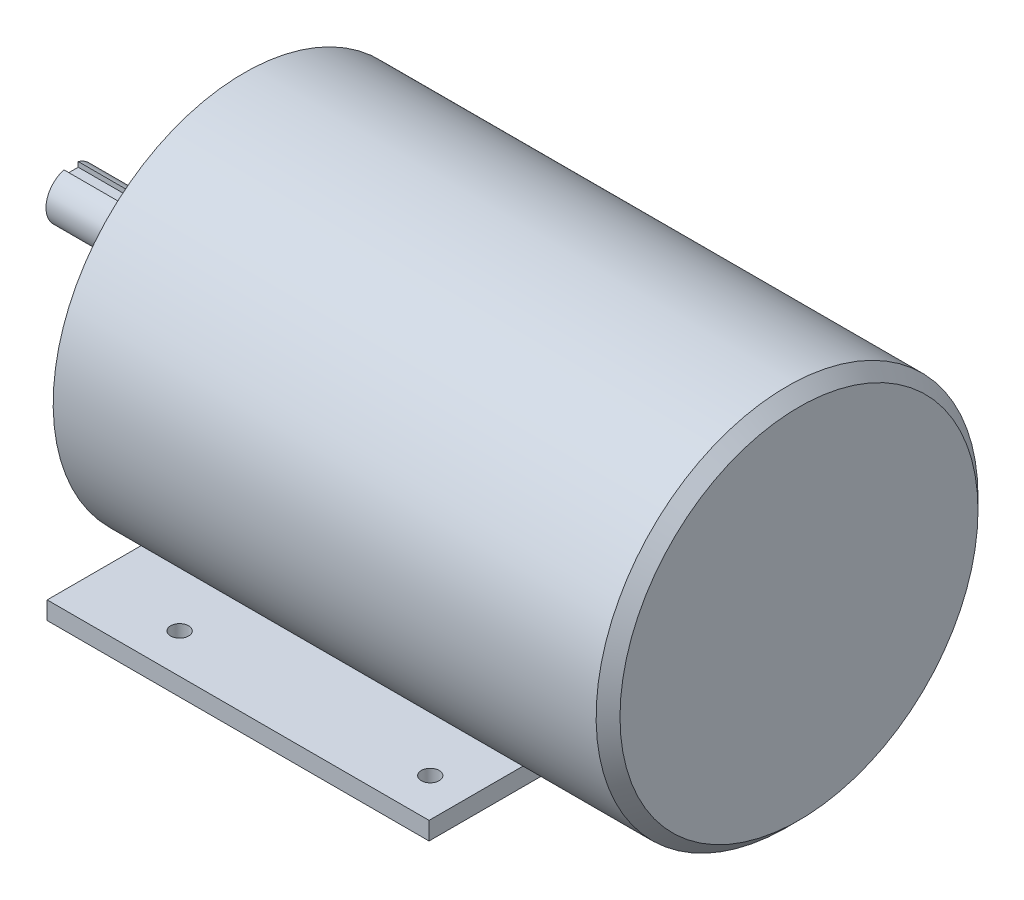
ISO-10303-21;
HEADER;
FILE_DESCRIPTION(('STEP AP214'),'2;1');
FILE_NAME('part.step','',(''),(''),'','','');
FILE_SCHEMA(('AUTOMOTIVE_DESIGN { 1 0 10303 214 1 1 1 1 }'));
ENDSEC;
DATA;
#1=APPLICATION_CONTEXT('core data for automotive mechanical design processes');
#2=APPLICATION_PROTOCOL_DEFINITION('international standard','automotive_design',2000,#1);
#3=PRODUCT_CONTEXT('',#1,'mechanical');
#4=PRODUCT('Part','Part','',(#3));
#5=PRODUCT_RELATED_PRODUCT_CATEGORY('part','',(#4));
#6=PRODUCT_DEFINITION_FORMATION('','',#4);
#7=PRODUCT_DEFINITION_CONTEXT('part definition',#1,'design');
#8=PRODUCT_DEFINITION('design','',#6,#7);
#9=PRODUCT_DEFINITION_SHAPE('','',#8);
#10=(LENGTH_UNIT() NAMED_UNIT(*) SI_UNIT(.MILLI.,.METRE.));
#11=(NAMED_UNIT(*) PLANE_ANGLE_UNIT() SI_UNIT($,.RADIAN.));
#12=(NAMED_UNIT(*) SI_UNIT($,.STERADIAN.) SOLID_ANGLE_UNIT());
#13=UNCERTAINTY_MEASURE_WITH_UNIT(LENGTH_MEASURE(1.E-05),#10,'distance_accuracy_value','');
#14=(GEOMETRIC_REPRESENTATION_CONTEXT(3) GLOBAL_UNCERTAINTY_ASSIGNED_CONTEXT((#13)) GLOBAL_UNIT_ASSIGNED_CONTEXT((#10,
#11,#12)) REPRESENTATION_CONTEXT('',''));
#15=CARTESIAN_POINT('',(0.,0.,0.));
#16=DIRECTION('',(0.,0.,1.));
#17=DIRECTION('',(1.,0.,0.));
#18=AXIS2_PLACEMENT_3D('',#15,#16,#17);
#19=CARTESIAN_POINT('',(610.,0.,0.));
#20=DIRECTION('',(-1.,0.,0.));
#21=DIRECTION('',(0.,0.,1.));
#22=AXIS2_PLACEMENT_3D('',#19,#20,#21);
#23=CYLINDRICAL_SURFACE('',#22,160.);
#24=CARTESIAN_POINT('',(600.,0.,0.));
#25=DIRECTION('',(1.,0.,0.));
#26=DIRECTION('',(0.,0.,-1.));
#27=AXIS2_PLACEMENT_3D('',#24,#25,#26);
#28=CIRCLE('',#27,160.);
#29=CARTESIAN_POINT('',(600.,0.,-160.));
#30=VERTEX_POINT('',#29);
#31=EDGE_CURVE('E315',#30,#30,#28,.F.);
#32=ORIENTED_EDGE('',*,*,#31,.T.);
#33=EDGE_LOOP('',(#32));
#34=FACE_BOUND('',#33,.T.);
#35=DIRECTION('',(-1.,0.,0.));
#36=VECTOR('',#35,1.);
#37=CARTESIAN_POINT('',(610.,-145.,-67.6387462923435));
#38=LINE('',#37,#36);
#39=CARTESIAN_POINT('',(145.021608211735,-145.,-67.6387462923435));
#40=VERTEX_POINT('',#39);
#41=CARTESIAN_POINT('',(460.,-145.,-67.6387462923435));
#42=VERTEX_POINT('',#41);
#43=EDGE_CURVE('E309',#40,#42,#38,.F.);
#44=ORIENTED_EDGE('',*,*,#43,.F.);
#45=CARTESIAN_POINT('',(145.021608211735,0.,0.));
#46=DIRECTION('',(1.,0.,0.));
#47=DIRECTION('',(0.,0.,-1.));
#48=AXIS2_PLACEMENT_3D('',#45,#46,#47);
#49=CIRCLE('',#48,160.);
#50=CARTESIAN_POINT('',(145.021608211735,-145.,67.6387462923433));
#51=VERTEX_POINT('',#50);
#52=EDGE_CURVE('E353',#40,#51,#49,.T.);
#53=ORIENTED_EDGE('',*,*,#52,.T.);
#54=DIRECTION('',(-1.,0.,0.));
#55=VECTOR('',#54,1.);
#56=CARTESIAN_POINT('',(610.,-145.,67.6387462923433));
#57=LINE('',#56,#55);
#58=CARTESIAN_POINT('',(460.,-145.,67.6387462923433));
#59=VERTEX_POINT('',#58);
#60=EDGE_CURVE('E312',#59,#51,#57,.T.);
#61=ORIENTED_EDGE('',*,*,#60,.F.);
#62=CARTESIAN_POINT('',(460.,0.,0.));
#63=DIRECTION('',(-1.,0.,0.));
#64=DIRECTION('',(0.,0.,1.));
#65=AXIS2_PLACEMENT_3D('',#62,#63,#64);
#66=CIRCLE('',#65,160.);
#67=CARTESIAN_POINT('',(460.,-160.,0.));
#68=VERTEX_POINT('',#67);
#69=EDGE_CURVE('E301',#68,#59,#66,.T.);
#70=ORIENTED_EDGE('',*,*,#69,.F.);
#71=EDGE_CURVE('E310',#42,#68,#66,.T.);
#72=ORIENTED_EDGE('',*,*,#71,.F.);
#73=EDGE_LOOP('',(#44,#53,#61,#70,#72));
#74=FACE_BOUND('',#73,.T.);
#75=ADVANCED_FACE('F44',(#34,#74),#23,.T.);
#76=CARTESIAN_POINT('',(610.,0.,0.));
#77=DIRECTION('',(1.,0.,0.));
#78=DIRECTION('',(0.,0.,-1.));
#79=AXIS2_PLACEMENT_3D('',#76,#77,#78);
#80=PLANE('',#79);
#81=CARTESIAN_POINT('',(610.,0.,0.));
#82=DIRECTION('',(1.,0.,0.));
#83=DIRECTION('',(0.,0.,-1.));
#84=AXIS2_PLACEMENT_3D('',#81,#82,#83);
#85=CIRCLE('',#84,150.);
#86=CARTESIAN_POINT('',(610.,0.,-150.));
#87=VERTEX_POINT('',#86);
#88=EDGE_CURVE('E318',#87,#87,#85,.T.);
#89=ORIENTED_EDGE('',*,*,#88,.T.);
#90=EDGE_LOOP('',(#89));
#91=FACE_BOUND('',#90,.T.);
#92=ADVANCED_FACE('F272',(#91),#80,.T.);
#93=CARTESIAN_POINT('',(460.,-145.,160.));
#94=DIRECTION('',(-1.,0.,0.));
#95=DIRECTION('',(0.,0.,1.));
#96=AXIS2_PLACEMENT_3D('',#93,#94,#95);
#97=PLANE('',#96);
#98=DIRECTION('',(0.,0.,-1.));
#99=VECTOR('',#98,1.);
#100=CARTESIAN_POINT('',(460.,-145.,160.));
#101=LINE('',#100,#99);
#102=CARTESIAN_POINT('',(460.,-145.,-160.));
#103=VERTEX_POINT('',#102);
#104=EDGE_CURVE('E388',#42,#103,#101,.T.);
#105=ORIENTED_EDGE('',*,*,#104,.F.);
#106=ORIENTED_EDGE('',*,*,#71,.T.);
#107=DIRECTION('',(0.,0.,-1.));
#108=VECTOR('',#107,1.);
#109=CARTESIAN_POINT('',(460.,-160.,160.));
#110=LINE('',#109,#108);
#111=CARTESIAN_POINT('',(460.,-160.,-160.));
#112=VERTEX_POINT('',#111);
#113=EDGE_CURVE('E381',#68,#112,#110,.T.);
#114=ORIENTED_EDGE('',*,*,#113,.T.);
#115=DIRECTION('',(0.,-1.,0.));
#116=VECTOR('',#115,1.);
#117=CARTESIAN_POINT('',(460.,-145.,-160.));
#118=LINE('',#117,#116);
#119=EDGE_CURVE('E298',#103,#112,#118,.T.);
#120=ORIENTED_EDGE('',*,*,#119,.F.);
#121=EDGE_LOOP('',(#105,#106,#114,#120));
#122=FACE_BOUND('',#121,.T.);
#123=ADVANCED_FACE('F271',(#122),#97,.F.);
#124=CARTESIAN_POINT('',(140.,-145.,160.));
#125=DIRECTION('',(1.,0.,0.));
#126=DIRECTION('',(0.,0.,-1.));
#127=AXIS2_PLACEMENT_3D('',#124,#125,#126);
#128=PLANE('',#127);
#129=DIRECTION('',(0.,0.,1.));
#130=VECTOR('',#129,1.);
#131=CARTESIAN_POINT('',(140.,-145.,160.));
#132=LINE('',#131,#130);
#133=CARTESIAN_POINT('',(140.,-145.,79.8435447691281));
#134=VERTEX_POINT('',#133);
#135=CARTESIAN_POINT('',(140.,-145.,160.));
#136=VERTEX_POINT('',#135);
#137=EDGE_CURVE('E390',#134,#136,#132,.T.);
#138=ORIENTED_EDGE('',*,*,#137,.F.);
#139=CARTESIAN_POINT('',(140.,0.,0.));
#140=DIRECTION('',(1.,0.,0.));
#141=DIRECTION('',(0.,0.,-1.));
#142=AXIS2_PLACEMENT_3D('',#139,#140,#141);
#143=CIRCLE('',#142,165.529428324089);
#144=CARTESIAN_POINT('',(140.,-160.,42.4263083628517));
#145=VERTEX_POINT('',#144);
#146=EDGE_CURVE('E344',#134,#145,#143,.T.);
#147=ORIENTED_EDGE('',*,*,#146,.T.);
#148=DIRECTION('',(0.,0.,1.));
#149=VECTOR('',#148,1.);
#150=CARTESIAN_POINT('',(140.,-160.,160.));
#151=LINE('',#150,#149);
#152=CARTESIAN_POINT('',(140.,-160.,160.));
#153=VERTEX_POINT('',#152);
#154=EDGE_CURVE('E402',#145,#153,#151,.T.);
#155=ORIENTED_EDGE('',*,*,#154,.T.);
#156=DIRECTION('',(0.,-1.,0.));
#157=VECTOR('',#156,1.);
#158=CARTESIAN_POINT('',(140.,-145.,160.));
#159=LINE('',#158,#157);
#160=EDGE_CURVE('E410',#136,#153,#159,.T.);
#161=ORIENTED_EDGE('',*,*,#160,.F.);
#162=EDGE_LOOP('',(#138,#147,#155,#161));
#163=FACE_BOUND('',#162,.T.);
#164=ADVANCED_FACE('F250',(#163),#128,.F.);
#165=CARTESIAN_POINT('',(0.,-145.,0.));
#166=DIRECTION('',(0.,-1.,0.));
#167=DIRECTION('',(0.,0.,-1.));
#168=AXIS2_PLACEMENT_3D('',#165,#166,#167);
#169=PLANE('',#168);
#170=CARTESIAN_POINT('',(218.,-145.,127.));
#171=DIRECTION('',(0.,-1.,0.));
#172=DIRECTION('',(0.,0.,-1.));
#173=AXIS2_PLACEMENT_3D('',#170,#171,#172);
#174=CIRCLE('',#173,7.50000000000001);
#175=CARTESIAN_POINT('',(218.,-145.,119.5));
#176=VERTEX_POINT('',#175);
#177=EDGE_CURVE('E360',#176,#176,#174,.T.);
#178=ORIENTED_EDGE('',*,*,#177,.T.);
#179=EDGE_LOOP('',(#178));
#180=FACE_BOUND('',#179,.T.);
#181=CARTESIAN_POINT('',(428.,-145.,127.));
#182=DIRECTION('',(0.,-1.,0.));
#183=DIRECTION('',(0.,0.,-1.));
#184=AXIS2_PLACEMENT_3D('',#181,#182,#183);
#185=CIRCLE('',#184,7.50000000000001);
#186=CARTESIAN_POINT('',(428.,-145.,119.5));
#187=VERTEX_POINT('',#186);
#188=EDGE_CURVE('E378',#187,#187,#185,.T.);
#189=ORIENTED_EDGE('',*,*,#188,.T.);
#190=EDGE_LOOP('',(#189));
#191=FACE_BOUND('',#190,.T.);
#192=DIRECTION('',(0.,0.,1.));
#193=VECTOR('',#192,1.);
#194=CARTESIAN_POINT('',(145.021608211735,-145.,0.));
#195=LINE('',#194,#193);
#196=CARTESIAN_POINT('',(145.021608211735,-145.,79.8435447691281));
#197=VERTEX_POINT('',#196);
#198=EDGE_CURVE('E356',#51,#197,#195,.T.);
#199=ORIENTED_EDGE('',*,*,#198,.T.);
#200=DIRECTION('',(1.,0.,0.));
#201=VECTOR('',#200,1.);
#202=CARTESIAN_POINT('',(0.,-145.,79.8435447691281));
#203=LINE('',#202,#201);
#204=EDGE_CURVE('E347',#197,#134,#203,.F.);
#205=ORIENTED_EDGE('',*,*,#204,.T.);
#206=ORIENTED_EDGE('',*,*,#137,.T.);
#207=DIRECTION('',(1.,0.,0.));
#208=VECTOR('',#207,1.);
#209=CARTESIAN_POINT('',(140.,-145.,160.));
#210=LINE('',#209,#208);
#211=CARTESIAN_POINT('',(460.,-145.,160.));
#212=VERTEX_POINT('',#211);
#213=EDGE_CURVE('E394',#136,#212,#210,.T.);
#214=ORIENTED_EDGE('',*,*,#213,.T.);
#215=EDGE_CURVE('E384',#212,#59,#101,.T.);
#216=ORIENTED_EDGE('',*,*,#215,.T.);
#217=ORIENTED_EDGE('',*,*,#60,.T.);
#218=EDGE_LOOP('',(#199,#205,#206,#214,#216,#217));
#219=FACE_BOUND('',#218,.T.);
#220=ADVANCED_FACE('F246',(#180,#191,#219),#169,.F.);
#221=CARTESIAN_POINT('',(428.,-145.,-127.));
#222=DIRECTION('',(0.,-1.,0.));
#223=DIRECTION('',(0.,0.,-1.));
#224=AXIS2_PLACEMENT_3D('',#221,#222,#223);
#225=CIRCLE('',#224,7.50000000000001);
#226=CARTESIAN_POINT('',(428.,-145.,-134.5));
#227=VERTEX_POINT('',#226);
#228=EDGE_CURVE('E373',#227,#227,#225,.T.);
#229=ORIENTED_EDGE('',*,*,#228,.T.);
#230=EDGE_LOOP('',(#229));
#231=FACE_BOUND('',#230,.T.);
#232=CARTESIAN_POINT('',(218.,-145.,-127.));
#233=DIRECTION('',(0.,-1.,0.));
#234=DIRECTION('',(0.,0.,-1.));
#235=AXIS2_PLACEMENT_3D('',#232,#233,#234);
#236=CIRCLE('',#235,7.50000000000001);
#237=CARTESIAN_POINT('',(218.,-145.,-134.5));
#238=VERTEX_POINT('',#237);
#239=EDGE_CURVE('E367',#238,#238,#236,.T.);
#240=ORIENTED_EDGE('',*,*,#239,.T.);
#241=EDGE_LOOP('',(#240));
#242=FACE_BOUND('',#241,.T.);
#243=CARTESIAN_POINT('',(140.,-145.,-160.));
#244=VERTEX_POINT('',#243);
#245=CARTESIAN_POINT('',(140.,-145.,-79.8435447691282));
#246=VERTEX_POINT('',#245);
#247=EDGE_CURVE('E391',#244,#246,#132,.T.);
#248=ORIENTED_EDGE('',*,*,#247,.T.);
#249=DIRECTION('',(1.,0.,0.));
#250=VECTOR('',#249,1.);
#251=CARTESIAN_POINT('',(0.,-145.,-79.8435447691282));
#252=LINE('',#251,#250);
#253=CARTESIAN_POINT('',(145.021608211735,-145.,-79.8435447691282));
#254=VERTEX_POINT('',#253);
#255=EDGE_CURVE('E67',#246,#254,#252,.T.);
#256=ORIENTED_EDGE('',*,*,#255,.T.);
#257=DIRECTION('',(0.,0.,1.));
#258=VECTOR('',#257,1.);
#259=CARTESIAN_POINT('',(145.021608211735,-145.,0.));
#260=LINE('',#259,#258);
#261=EDGE_CURVE('E350',#254,#40,#260,.T.);
#262=ORIENTED_EDGE('',*,*,#261,.T.);
#263=ORIENTED_EDGE('',*,*,#43,.T.);
#264=ORIENTED_EDGE('',*,*,#104,.T.);
#265=DIRECTION('',(-1.,0.,0.));
#266=VECTOR('',#265,1.);
#267=CARTESIAN_POINT('',(140.,-145.,-160.));
#268=LINE('',#267,#266);
#269=EDGE_CURVE('E387',#103,#244,#268,.T.);
#270=ORIENTED_EDGE('',*,*,#269,.T.);
#271=EDGE_LOOP('',(#248,#256,#262,#263,#264,#270));
#272=FACE_BOUND('',#271,.T.);
#273=ADVANCED_FACE('F249',(#231,#242,#272),#169,.F.);
#274=CARTESIAN_POINT('',(0.,-160.,0.));
#275=DIRECTION('',(0.,-1.,0.));
#276=DIRECTION('',(0.,0.,-1.));
#277=AXIS2_PLACEMENT_3D('',#274,#275,#276);
#278=PLANE('',#277);
#279=DIRECTION('',(1.,0.,0.));
#280=VECTOR('',#279,1.);
#281=CARTESIAN_POINT('',(0.,-160.,-42.4263083628517));
#282=LINE('',#281,#280);
#283=CARTESIAN_POINT('',(140.,-160.,-42.4263083628517));
#284=VERTEX_POINT('',#283);
#285=CARTESIAN_POINT('',(145.021608211735,-160.,-42.4263083628517));
#286=VERTEX_POINT('',#285);
#287=EDGE_CURVE('E332',#284,#286,#282,.T.);
#288=ORIENTED_EDGE('',*,*,#287,.F.);
#289=CARTESIAN_POINT('',(140.,-160.,-160.));
#290=VERTEX_POINT('',#289);
#291=EDGE_CURVE('E403',#290,#284,#151,.T.);
#292=ORIENTED_EDGE('',*,*,#291,.F.);
#293=DIRECTION('',(-1.,0.,0.));
#294=VECTOR('',#293,1.);
#295=CARTESIAN_POINT('',(140.,-160.,-160.));
#296=LINE('',#295,#294);
#297=EDGE_CURVE('E400',#112,#290,#296,.T.);
#298=ORIENTED_EDGE('',*,*,#297,.F.);
#299=ORIENTED_EDGE('',*,*,#113,.F.);
#300=CARTESIAN_POINT('',(460.,-160.,160.));
#301=VERTEX_POINT('',#300);
#302=EDGE_CURVE('E397',#301,#68,#110,.T.);
#303=ORIENTED_EDGE('',*,*,#302,.F.);
#304=DIRECTION('',(1.,0.,0.));
#305=VECTOR('',#304,1.);
#306=CARTESIAN_POINT('',(140.,-160.,160.));
#307=LINE('',#306,#305);
#308=EDGE_CURVE('E406',#153,#301,#307,.T.);
#309=ORIENTED_EDGE('',*,*,#308,.F.);
#310=ORIENTED_EDGE('',*,*,#154,.F.);
#311=DIRECTION('',(1.,0.,0.));
#312=VECTOR('',#311,1.);
#313=CARTESIAN_POINT('',(0.,-160.,42.4263083628517));
#314=LINE('',#313,#312);
#315=CARTESIAN_POINT('',(145.021608211735,-160.,42.4263083628517));
#316=VERTEX_POINT('',#315);
#317=EDGE_CURVE('E342',#316,#145,#314,.F.);
#318=ORIENTED_EDGE('',*,*,#317,.F.);
#319=DIRECTION('',(0.,0.,1.));
#320=VECTOR('',#319,1.);
#321=CARTESIAN_POINT('',(145.021608211735,-160.,0.));
#322=LINE('',#321,#320);
#323=EDGE_CURVE('E323',#286,#316,#322,.T.);
#324=ORIENTED_EDGE('',*,*,#323,.F.);
#325=EDGE_LOOP('',(#288,#292,#298,#299,#303,#309,#310,#318,#324));
#326=FACE_BOUND('',#325,.T.);
#327=CARTESIAN_POINT('',(428.,-160.,-127.));
#328=DIRECTION('',(0.,-1.,0.));
#329=DIRECTION('',(0.,0.,-1.));
#330=AXIS2_PLACEMENT_3D('',#327,#328,#329);
#331=CIRCLE('',#330,7.50000000000001);
#332=CARTESIAN_POINT('',(428.,-160.,-134.5));
#333=VERTEX_POINT('',#332);
#334=EDGE_CURVE('E359',#333,#333,#331,.T.);
#335=ORIENTED_EDGE('',*,*,#334,.F.);
#336=EDGE_LOOP('',(#335));
#337=FACE_BOUND('',#336,.T.);
#338=CARTESIAN_POINT('',(218.,-160.,-127.));
#339=DIRECTION('',(0.,-1.,0.));
#340=DIRECTION('',(0.,0.,-1.));
#341=AXIS2_PLACEMENT_3D('',#338,#339,#340);
#342=CIRCLE('',#341,7.50000000000001);
#343=CARTESIAN_POINT('',(218.,-160.,-134.5));
#344=VERTEX_POINT('',#343);
#345=EDGE_CURVE('E370',#344,#344,#342,.T.);
#346=ORIENTED_EDGE('',*,*,#345,.F.);
#347=EDGE_LOOP('',(#346));
#348=FACE_BOUND('',#347,.T.);
#349=CARTESIAN_POINT('',(218.,-160.,127.));
#350=DIRECTION('',(0.,-1.,0.));
#351=DIRECTION('',(0.,0.,-1.));
#352=AXIS2_PLACEMENT_3D('',#349,#350,#351);
#353=CIRCLE('',#352,7.50000000000001);
#354=CARTESIAN_POINT('',(218.,-160.,119.5));
#355=VERTEX_POINT('',#354);
#356=EDGE_CURVE('E364',#355,#355,#353,.T.);
#357=ORIENTED_EDGE('',*,*,#356,.F.);
#358=EDGE_LOOP('',(#357));
#359=FACE_BOUND('',#358,.T.);
#360=CARTESIAN_POINT('',(428.,-160.,127.));
#361=DIRECTION('',(0.,-1.,0.));
#362=DIRECTION('',(0.,0.,-1.));
#363=AXIS2_PLACEMENT_3D('',#360,#361,#362);
#364=CIRCLE('',#363,7.50000000000001);
#365=CARTESIAN_POINT('',(428.,-160.,119.5));
#366=VERTEX_POINT('',#365);
#367=EDGE_CURVE('E363',#366,#366,#364,.T.);
#368=ORIENTED_EDGE('',*,*,#367,.F.);
#369=EDGE_LOOP('',(#368));
#370=FACE_BOUND('',#369,.T.);
#371=ADVANCED_FACE('F252',(#326,#337,#348,#359,#370),#278,.T.);
#372=ORIENTED_EDGE('',*,*,#302,.T.);
#373=ORIENTED_EDGE('',*,*,#69,.T.);
#374=ORIENTED_EDGE('',*,*,#215,.F.);
#375=DIRECTION('',(0.,-1.,0.));
#376=VECTOR('',#375,1.);
#377=CARTESIAN_POINT('',(460.,-145.,160.));
#378=LINE('',#377,#376);
#379=EDGE_CURVE('E396',#212,#301,#378,.T.);
#380=ORIENTED_EDGE('',*,*,#379,.T.);
#381=EDGE_LOOP('',(#372,#373,#374,#380));
#382=FACE_BOUND('',#381,.T.);
#383=ADVANCED_FACE('F255',(#382),#97,.F.);
#384=CARTESIAN_POINT('',(140.,-145.,-160.));
#385=DIRECTION('',(0.,0.,1.));
#386=DIRECTION('',(1.,0.,0.));
#387=AXIS2_PLACEMENT_3D('',#384,#385,#386);
#388=PLANE('',#387);
#389=ORIENTED_EDGE('',*,*,#297,.T.);
#390=DIRECTION('',(0.,-1.,0.));
#391=VECTOR('',#390,1.);
#392=CARTESIAN_POINT('',(140.,-145.,-160.));
#393=LINE('',#392,#391);
#394=EDGE_CURVE('E304',#244,#290,#393,.T.);
#395=ORIENTED_EDGE('',*,*,#394,.F.);
#396=ORIENTED_EDGE('',*,*,#269,.F.);
#397=ORIENTED_EDGE('',*,*,#119,.T.);
#398=EDGE_LOOP('',(#389,#395,#396,#397));
#399=FACE_BOUND('',#398,.T.);
#400=ADVANCED_FACE('F263',(#399),#388,.F.);
#401=ORIENTED_EDGE('',*,*,#291,.T.);
#402=CARTESIAN_POINT('',(140.,0.,0.));
#403=DIRECTION('',(1.,0.,0.));
#404=DIRECTION('',(0.,0.,-1.));
#405=AXIS2_PLACEMENT_3D('',#402,#403,#404);
#406=CIRCLE('',#405,165.529428324089);
#407=EDGE_CURVE('E321',#284,#246,#406,.T.);
#408=ORIENTED_EDGE('',*,*,#407,.T.);
#409=ORIENTED_EDGE('',*,*,#247,.F.);
#410=ORIENTED_EDGE('',*,*,#394,.T.);
#411=EDGE_LOOP('',(#401,#408,#409,#410));
#412=FACE_BOUND('',#411,.T.);
#413=ADVANCED_FACE('F259',(#412),#128,.F.);
#414=CARTESIAN_POINT('',(140.,-145.,160.));
#415=DIRECTION('',(0.,0.,-1.));
#416=DIRECTION('',(-1.,0.,0.));
#417=AXIS2_PLACEMENT_3D('',#414,#415,#416);
#418=PLANE('',#417);
#419=ORIENTED_EDGE('',*,*,#308,.T.);
#420=ORIENTED_EDGE('',*,*,#379,.F.);
#421=ORIENTED_EDGE('',*,*,#213,.F.);
#422=ORIENTED_EDGE('',*,*,#160,.T.);
#423=EDGE_LOOP('',(#419,#420,#421,#422));
#424=FACE_BOUND('',#423,.T.);
#425=ADVANCED_FACE('F244',(#424),#418,.F.);
#426=CARTESIAN_POINT('',(428.,-145.,127.));
#427=DIRECTION('',(0.,-1.,0.));
#428=DIRECTION('',(0.,0.,-1.));
#429=AXIS2_PLACEMENT_3D('',#426,#427,#428);
#430=CYLINDRICAL_SURFACE('',#429,7.50000000000001);
#431=ORIENTED_EDGE('',*,*,#188,.F.);
#432=EDGE_LOOP('',(#431));
#433=FACE_BOUND('',#432,.T.);
#434=ORIENTED_EDGE('',*,*,#367,.T.);
#435=EDGE_LOOP('',(#434));
#436=FACE_BOUND('',#435,.T.);
#437=ADVANCED_FACE('F233',(#433,#436),#430,.F.);
#438=CARTESIAN_POINT('',(218.,-145.,127.));
#439=DIRECTION('',(0.,-1.,0.));
#440=DIRECTION('',(0.,0.,-1.));
#441=AXIS2_PLACEMENT_3D('',#438,#439,#440);
#442=CYLINDRICAL_SURFACE('',#441,7.50000000000001);
#443=ORIENTED_EDGE('',*,*,#177,.F.);
#444=EDGE_LOOP('',(#443));
#445=FACE_BOUND('',#444,.T.);
#446=ORIENTED_EDGE('',*,*,#356,.T.);
#447=EDGE_LOOP('',(#446));
#448=FACE_BOUND('',#447,.T.);
#449=ADVANCED_FACE('F229',(#445,#448),#442,.F.);
#450=CARTESIAN_POINT('',(218.,-145.,-127.));
#451=DIRECTION('',(0.,-1.,0.));
#452=DIRECTION('',(0.,0.,-1.));
#453=AXIS2_PLACEMENT_3D('',#450,#451,#452);
#454=CYLINDRICAL_SURFACE('',#453,7.50000000000001);
#455=ORIENTED_EDGE('',*,*,#239,.F.);
#456=EDGE_LOOP('',(#455));
#457=FACE_BOUND('',#456,.T.);
#458=ORIENTED_EDGE('',*,*,#345,.T.);
#459=EDGE_LOOP('',(#458));
#460=FACE_BOUND('',#459,.T.);
#461=ADVANCED_FACE('F232',(#457,#460),#454,.F.);
#462=CARTESIAN_POINT('',(428.,-145.,-127.));
#463=DIRECTION('',(0.,-1.,0.));
#464=DIRECTION('',(0.,0.,-1.));
#465=AXIS2_PLACEMENT_3D('',#462,#463,#464);
#466=CYLINDRICAL_SURFACE('',#465,7.50000000000001);
#467=ORIENTED_EDGE('',*,*,#228,.F.);
#468=EDGE_LOOP('',(#467));
#469=FACE_BOUND('',#468,.T.);
#470=ORIENTED_EDGE('',*,*,#334,.T.);
#471=EDGE_LOOP('',(#470));
#472=FACE_BOUND('',#471,.T.);
#473=ADVANCED_FACE('F237',(#469,#472),#466,.F.);
#474=CARTESIAN_POINT('',(610.,0.,0.));
#475=DIRECTION('',(-1.,0.,0.));
#476=DIRECTION('',(0.,0.,1.));
#477=AXIS2_PLACEMENT_3D('',#474,#475,#476);
#478=CONICAL_SURFACE('',#477,150.,0.785398163397446);
#479=ORIENTED_EDGE('',*,*,#31,.F.);
#480=EDGE_LOOP('',(#479));
#481=FACE_BOUND('',#480,.T.);
#482=ORIENTED_EDGE('',*,*,#88,.F.);
#483=EDGE_LOOP('',(#482));
#484=FACE_BOUND('',#483,.T.);
#485=ADVANCED_FACE('F46',(#481,#484),#478,.T.);
#486=CARTESIAN_POINT('',(145.021608211735,0.,0.));
#487=DIRECTION('',(1.,0.,0.));
#488=DIRECTION('',(0.,0.,-1.));
#489=AXIS2_PLACEMENT_3D('',#486,#487,#488);
#490=PLANE('',#489);
#491=CARTESIAN_POINT('',(145.021608211735,0.,0.));
#492=DIRECTION('',(1.,0.,0.));
#493=DIRECTION('',(0.,0.,-1.));
#494=AXIS2_PLACEMENT_3D('',#491,#492,#493);
#495=CIRCLE('',#494,129.77719616388);
#496=CARTESIAN_POINT('',(145.021608211735,0.,-129.77719616388));
#497=VERTEX_POINT('',#496);
#498=EDGE_CURVE('E428',#497,#497,#495,.T.);
#499=ORIENTED_EDGE('',*,*,#498,.T.);
#500=EDGE_LOOP('',(#499));
#501=FACE_BOUND('',#500,.T.);
#502=ORIENTED_EDGE('',*,*,#52,.F.);
#503=ORIENTED_EDGE('',*,*,#261,.F.);
#504=CARTESIAN_POINT('',(145.021608211735,0.,0.));
#505=DIRECTION('',(1.,0.,0.));
#506=DIRECTION('',(0.,0.,-1.));
#507=AXIS2_PLACEMENT_3D('',#504,#505,#506);
#508=CIRCLE('',#507,165.529428324089);
#509=EDGE_CURVE('E326',#286,#254,#508,.T.);
#510=ORIENTED_EDGE('',*,*,#509,.F.);
#511=ORIENTED_EDGE('',*,*,#323,.T.);
#512=EDGE_CURVE('E193',#197,#316,#508,.T.);
#513=ORIENTED_EDGE('',*,*,#512,.F.);
#514=ORIENTED_EDGE('',*,*,#198,.F.);
#515=EDGE_LOOP('',(#502,#503,#510,#511,#513,#514));
#516=FACE_BOUND('',#515,.T.);
#517=ADVANCED_FACE('F203',(#501,#516),#490,.F.);
#518=CARTESIAN_POINT('',(0.,0.,0.));
#519=DIRECTION('',(1.,0.,0.));
#520=DIRECTION('',(0.,0.,-1.));
#521=AXIS2_PLACEMENT_3D('',#518,#519,#520);
#522=CYLINDRICAL_SURFACE('',#521,165.529428324089);
#523=ORIENTED_EDGE('',*,*,#512,.T.);
#524=ORIENTED_EDGE('',*,*,#317,.T.);
#525=ORIENTED_EDGE('',*,*,#146,.F.);
#526=ORIENTED_EDGE('',*,*,#204,.F.);
#527=EDGE_LOOP('',(#523,#524,#525,#526));
#528=FACE_BOUND('',#527,.T.);
#529=ADVANCED_FACE('F206',(#528),#522,.F.);
#530=ORIENTED_EDGE('',*,*,#407,.F.);
#531=ORIENTED_EDGE('',*,*,#287,.T.);
#532=ORIENTED_EDGE('',*,*,#509,.T.);
#533=ORIENTED_EDGE('',*,*,#255,.F.);
#534=EDGE_LOOP('',(#530,#531,#532,#533));
#535=FACE_BOUND('',#534,.T.);
#536=ADVANCED_FACE('F224',(#535),#522,.F.);
#537=CARTESIAN_POINT('',(110.,0.,0.));
#538=DIRECTION('',(1.,0.,0.));
#539=DIRECTION('',(0.,0.,-1.));
#540=AXIS2_PLACEMENT_3D('',#537,#538,#539);
#541=CONICAL_SURFACE('',#540,37.0561374852697,1.25236638789292);
#542=CARTESIAN_POINT('',(115.568052013893,0.,0.));
#543=DIRECTION('',(1.,0.,0.));
#544=DIRECTION('',(0.,0.,-1.));
#545=AXIS2_PLACEMENT_3D('',#542,#543,#544);
#546=CIRCLE('',#545,53.9470482330029);
#547=CARTESIAN_POINT('',(115.568052013893,0.,-53.947048233003));
#548=VERTEX_POINT('',#547);
#549=EDGE_CURVE('E333',#548,#548,#546,.T.);
#550=ORIENTED_EDGE('',*,*,#549,.F.);
#551=EDGE_LOOP('',(#550));
#552=FACE_BOUND('',#551,.T.);
#553=CARTESIAN_POINT('',(110.,0.,0.));
#554=DIRECTION('',(1.,0.,0.));
#555=DIRECTION('',(0.,0.,-1.));
#556=AXIS2_PLACEMENT_3D('',#553,#554,#555);
#557=CIRCLE('',#556,37.0561374852697);
#558=CARTESIAN_POINT('',(110.,0.,-37.0561374852698));
#559=VERTEX_POINT('',#558);
#560=EDGE_CURVE('E330',#559,#559,#557,.T.);
#561=ORIENTED_EDGE('',*,*,#560,.T.);
#562=EDGE_LOOP('',(#561));
#563=FACE_BOUND('',#562,.T.);
#564=ADVANCED_FACE('F220',(#552,#563),#541,.T.);
#565=CARTESIAN_POINT('',(115.568052013893,0.,0.));
#566=DIRECTION('',(1.,0.,0.));
#567=DIRECTION('',(0.,0.,-1.));
#568=AXIS2_PLACEMENT_3D('',#565,#566,#567);
#569=CONICAL_SURFACE('',#568,53.9470482330029,0.960070362405688);
#570=CARTESIAN_POINT('',(136.897249661377,0.,0.));
#571=DIRECTION('',(1.,0.,0.));
#572=DIRECTION('',(0.,0.,-1.));
#573=AXIS2_PLACEMENT_3D('',#570,#571,#572);
#574=CIRCLE('',#573,84.4173305865506);
#575=CARTESIAN_POINT('',(136.897249661377,0.,-84.4173305865508));
#576=VERTEX_POINT('',#575);
#577=EDGE_CURVE('E337',#576,#576,#574,.T.);
#578=ORIENTED_EDGE('',*,*,#577,.F.);
#579=EDGE_LOOP('',(#578));
#580=FACE_BOUND('',#579,.T.);
#581=ORIENTED_EDGE('',*,*,#549,.T.);
#582=EDGE_LOOP('',(#581));
#583=FACE_BOUND('',#582,.T.);
#584=ADVANCED_FACE('F216',(#580,#583),#569,.T.);
#585=CARTESIAN_POINT('',(136.897249661377,0.,0.));
#586=DIRECTION('',(1.,0.,0.));
#587=DIRECTION('',(0.,0.,-1.));
#588=AXIS2_PLACEMENT_3D('',#585,#586,#587);
#589=PLANE('',#588);
#590=CARTESIAN_POINT('',(136.897249661377,0.,0.));
#591=DIRECTION('',(1.,0.,0.));
#592=DIRECTION('',(0.,0.,-1.));
#593=AXIS2_PLACEMENT_3D('',#590,#591,#592);
#594=CIRCLE('',#593,105.131626256437);
#595=CARTESIAN_POINT('',(136.897249661377,0.,-105.131626256437));
#596=VERTEX_POINT('',#595);
#597=EDGE_CURVE('E430',#596,#596,#594,.T.);
#598=ORIENTED_EDGE('',*,*,#597,.F.);
#599=EDGE_LOOP('',(#598));
#600=FACE_BOUND('',#599,.T.);
#601=ORIENTED_EDGE('',*,*,#577,.T.);
#602=EDGE_LOOP('',(#601));
#603=FACE_BOUND('',#602,.T.);
#604=ADVANCED_FACE('F212',(#600,#603),#589,.F.);
#605=CARTESIAN_POINT('',(136.897249661377,0.,0.));
#606=DIRECTION('',(1.,0.,0.));
#607=DIRECTION('',(0.,0.,-1.));
#608=AXIS2_PLACEMENT_3D('',#605,#606,#607);
#609=CONICAL_SURFACE('',#608,105.131626256437,1.25236638789292);
#610=ORIENTED_EDGE('',*,*,#498,.F.);
#611=EDGE_LOOP('',(#610));
#612=FACE_BOUND('',#611,.T.);
#613=ORIENTED_EDGE('',*,*,#597,.T.);
#614=EDGE_LOOP('',(#613));
#615=FACE_BOUND('',#614,.T.);
#616=ADVANCED_FACE('F208',(#612,#615),#609,.T.);
#617=CARTESIAN_POINT('',(0.,0.,0.));
#618=DIRECTION('',(1.,0.,0.));
#619=DIRECTION('',(0.,0.,-1.));
#620=AXIS2_PLACEMENT_3D('',#617,#618,#619);
#621=PLANE('',#620);
#622=CARTESIAN_POINT('',(0.,0.,0.));
#623=DIRECTION('',(-1.,0.,0.));
#624=DIRECTION('',(0.,0.,1.));
#625=AXIS2_PLACEMENT_3D('',#622,#623,#624);
#626=CIRCLE('',#625,6.);
#627=CARTESIAN_POINT('',(0.,0.,6.00000000000001));
#628=VERTEX_POINT('',#627);
#629=EDGE_CURVE('E174',#628,#628,#626,.T.);
#630=ORIENTED_EDGE('',*,*,#629,.F.);
#631=EDGE_LOOP('',(#630));
#632=FACE_BOUND('',#631,.T.);
#633=CARTESIAN_POINT('',(0.,0.,0.));
#634=DIRECTION('',(1.,0.,0.));
#635=DIRECTION('',(0.,0.,-1.));
#636=AXIS2_PLACEMENT_3D('',#633,#634,#635);
#637=CIRCLE('',#636,21.);
#638=CARTESIAN_POINT('',(0.,20.1246117974981,6.00000000000001));
#639=VERTEX_POINT('',#638);
#640=CARTESIAN_POINT('',(0.,20.1246117974981,-6.00000000000001));
#641=VERTEX_POINT('',#640);
#642=EDGE_CURVE('E295',#639,#641,#637,.T.);
#643=ORIENTED_EDGE('',*,*,#642,.F.);
#644=DIRECTION('',(0.,1.,0.));
#645=VECTOR('',#644,1.);
#646=CARTESIAN_POINT('',(0.,16.,6.00000000000001));
#647=LINE('',#646,#645);
#648=CARTESIAN_POINT('',(0.,16.,6.00000000000001));
#649=VERTEX_POINT('',#648);
#650=EDGE_CURVE('E183',#649,#639,#647,.T.);
#651=ORIENTED_EDGE('',*,*,#650,.F.);
#652=DIRECTION('',(0.,0.,1.));
#653=VECTOR('',#652,1.);
#654=CARTESIAN_POINT('',(0.,16.,-6.00000000000001));
#655=LINE('',#654,#653);
#656=CARTESIAN_POINT('',(0.,16.,-6.00000000000001));
#657=VERTEX_POINT('',#656);
#658=EDGE_CURVE('E167',#657,#649,#655,.T.);
#659=ORIENTED_EDGE('',*,*,#658,.F.);
#660=DIRECTION('',(0.,1.,0.));
#661=VECTOR('',#660,1.);
#662=CARTESIAN_POINT('',(0.,16.,-6.00000000000001));
#663=LINE('',#662,#661);
#664=EDGE_CURVE('E158',#657,#641,#663,.T.);
#665=ORIENTED_EDGE('',*,*,#664,.T.);
#666=EDGE_LOOP('',(#643,#651,#659,#665));
#667=FACE_BOUND('',#666,.T.);
#668=ADVANCED_FACE('F211',(#632,#667),#621,.F.);
#669=CARTESIAN_POINT('',(110.,0.,0.));
#670=DIRECTION('',(-1.,0.,0.));
#671=DIRECTION('',(0.,0.,1.));
#672=AXIS2_PLACEMENT_3D('',#669,#670,#671);
#673=CYLINDRICAL_SURFACE('',#672,21.);
#674=DIRECTION('',(-1.,0.,0.));
#675=VECTOR('',#674,1.);
#676=CARTESIAN_POINT('',(110.,20.1246117974981,-6.00000000000001));
#677=LINE('',#676,#675);
#678=CARTESIAN_POINT('',(104.,20.1246117974981,-6.00000000000001));
#679=VERTEX_POINT('',#678);
#680=EDGE_CURVE('E13',#641,#679,#677,.F.);
#681=ORIENTED_EDGE('',*,*,#680,.T.);
#682=CARTESIAN_POINT('',(104.,20.1246117974981,-6.00000000000001));
#683=CARTESIAN_POINT('',(104.165052331312,20.124589484457,-6.00002192169975));
#684=CARTESIAN_POINT('',(104.330096651925,20.1266415650335,-5.9931904240759));
#685=CARTESIAN_POINT('',(104.658933521624,20.1347317436705,-5.96598259693693));
#686=CARTESIAN_POINT('',(104.822726323157,20.1407690151806,-5.94560907610498));
#687=CARTESIAN_POINT('',(105.147509956324,20.1566481622527,-5.89154299098999));
#688=CARTESIAN_POINT('',(105.308506490729,20.1664810208216,-5.85788198887894));
#689=CARTESIAN_POINT('',(105.626960229472,20.1896457121067,-5.77753958210297));
#690=CARTESIAN_POINT('',(105.78441735477,20.2029776228772,-5.73085788698051));
#691=CARTESIAN_POINT('',(106.094635546118,20.2327374247249,-5.62488729317036));
#692=CARTESIAN_POINT('',(106.247398940812,20.2491637507907,-5.56560476546174));
#693=CARTESIAN_POINT('',(106.547368364294,20.2846467474582,-5.43485915630497));
#694=CARTESIAN_POINT('',(106.694572302487,20.3037043952519,-5.36339154736577));
#695=CARTESIAN_POINT('',(106.98243459612,20.3439081708857,-5.20881695763318));
#696=CARTESIAN_POINT('',(107.123092954147,20.3650542979004,-5.12570998143985));
#697=CARTESIAN_POINT('',(107.39705541808,20.4088630364894,-4.94839867436058));
#698=CARTESIAN_POINT('',(107.530356713522,20.4315262203764,-4.85419014508328));
#699=CARTESIAN_POINT('',(107.792038174735,20.4783436926205,-4.65278362553807));
#700=CARTESIAN_POINT('',(107.92020679912,20.5025212494045,-4.54531610125276));
#701=CARTESIAN_POINT('',(108.167146297308,20.5511665277305,-4.32005021369054));
#702=CARTESIAN_POINT('',(108.285913661986,20.5756343537369,-4.2022480271534));
#703=CARTESIAN_POINT('',(108.513215821272,20.6241797197623,-3.95712206741071));
#704=CARTESIAN_POINT('',(108.621752630168,20.6482573358332,-3.82980017742367));
#705=CARTESIAN_POINT('',(108.827939004997,20.6953839164428,-3.56636964243009));
#706=CARTESIAN_POINT('',(108.925584545105,20.7184324987362,-3.43025777747809));
#707=CARTESIAN_POINT('',(109.110945589449,20.7632735217347,-3.14758929991085));
#708=CARTESIAN_POINT('',(109.198446889581,20.7850352899035,-3.00088721837235));
#709=CARTESIAN_POINT('',(109.360771883345,20.826226420028,-2.7002441525681));
#710=CARTESIAN_POINT('',(109.435591029334,20.8456549445903,-2.54630059678401));
#711=CARTESIAN_POINT('',(109.571883383942,20.8816082415408,-2.23235057760215));
#712=CARTESIAN_POINT('',(109.633361393562,20.898134058101,-2.07234631966331));
#713=CARTESIAN_POINT('',(109.742475461034,20.9278108104084,-1.74738349510967));
#714=CARTESIAN_POINT('',(109.790112095636,20.9409618867737,-1.58242513524156));
#715=CARTESIAN_POINT('',(109.870065575121,20.9632114411614,-1.25311298298004));
#716=CARTESIAN_POINT('',(109.902747347622,20.9724060858907,-1.08885424992108));
#717=CARTESIAN_POINT('',(109.954270098755,20.9869654862023,-0.758072191863173));
#718=CARTESIAN_POINT('',(109.973116248908,20.9923316727767,-0.591549736734737));
#719=CARTESIAN_POINT('',(109.996814450333,20.9990869856429,-0.257425560637049));
#720=CARTESIAN_POINT('',(110.001666015127,21.0004759736797,-0.0898238023521108));
#721=CARTESIAN_POINT('',(109.997328274917,20.999236691677,0.245181542828494));
#722=CARTESIAN_POINT('',(109.988139201944,20.9966084880239,0.41258513295325));
#723=CARTESIAN_POINT('',(109.9562782772,20.9875445764644,0.741067651658912));
#724=CARTESIAN_POINT('',(109.934007021276,20.9812220240655,0.902188755140099));
#725=CARTESIAN_POINT('',(109.876494480959,20.9650286514685,1.2219709065223));
#726=CARTESIAN_POINT('',(109.841249023442,20.9551566896347,1.38063114576115));
#727=CARTESIAN_POINT('',(109.758089652863,20.9321284663263,1.69432288207989));
#728=CARTESIAN_POINT('',(109.710177676022,20.918972706835,1.8493549298311));
#729=CARTESIAN_POINT('',(109.602064962077,20.8897205698511,2.15478873602951));
#730=CARTESIAN_POINT('',(109.541863855878,20.8736241040379,2.30519035524905));
#731=CARTESIAN_POINT('',(109.408898376357,20.8387145142278,2.60202980978102));
#732=CARTESIAN_POINT('',(109.336002252832,20.8198732783987,2.74840530116378));
#733=CARTESIAN_POINT('',(109.178676237705,20.7801082571492,3.0344604453685));
#734=CARTESIAN_POINT('',(109.09424991134,20.7591851160121,3.17414215000025));
#735=CARTESIAN_POINT('',(108.914385979091,20.7157807359019,3.44606990247428));
#736=CARTESIAN_POINT('',(108.818942919324,20.6932987274225,3.57831221881556));
#737=CARTESIAN_POINT('',(108.617740718797,20.6473712971919,3.83444718075923));
#738=CARTESIAN_POINT('',(108.511984957411,20.6239261924859,3.95834253922787));
#739=CARTESIAN_POINT('',(108.28687436197,20.5758300072593,4.20132091996744));
#740=CARTESIAN_POINT('',(108.16717064798,20.551165615785,4.32007832115663));
#741=CARTESIAN_POINT('',(107.918208426458,20.5021333353903,4.54708837545199));
#742=CARTESIAN_POINT('',(107.788953240124,20.4777653468064,4.65534464996525));
#743=CARTESIAN_POINT('',(107.52158790413,20.4299846752419,4.86074636422663));
#744=CARTESIAN_POINT('',(107.383471887605,20.4065726423519,4.95788432140757));
#745=CARTESIAN_POINT('',(107.099406524312,20.3614014610979,5.1402485506112));
#746=CARTESIAN_POINT('',(106.953460255218,20.3396416713267,5.22547945590104));
#747=CARTESIAN_POINT('',(106.65330100046,20.2982196174412,5.38414968403489));
#748=CARTESIAN_POINT('',(106.499025684695,20.2785778839985,5.45747656574092));
#749=CARTESIAN_POINT('',(106.184550166332,20.242230137917,5.59078652189582));
#750=CARTESIAN_POINT('',(106.024352400501,20.2255229337991,5.65077501464741));
#751=CARTESIAN_POINT('',(105.699294796548,20.1955798271004,5.7568738046708));
#752=CARTESIAN_POINT('',(105.534440027613,20.1823402998656,5.80299860073585));
#753=CARTESIAN_POINT('',(105.201205342495,20.1597438752569,5.88101802101862));
#754=CARTESIAN_POINT('',(105.032827097457,20.1503851792111,5.91291923804011));
#755=CARTESIAN_POINT('',(104.720401863552,20.136996182678,5.95834488604582));
#756=CARTESIAN_POINT('',(104.576682044629,20.1323602730056,5.97396720737163));
#757=CARTESIAN_POINT('',(104.288645245918,20.1261641867038,5.99479248698431));
#758=CARTESIAN_POINT('',(104.144329514862,20.1245993190641,6.00001133674439));
#759=CARTESIAN_POINT('',(104.,20.1246117974981,6.00000000000001));
#760=B_SPLINE_CURVE_WITH_KNOTS('',3,(#682,#683,#684,#685,#686,#687,#688,#689,#690,#691,#692,
#693,#694,#695,#696,#697,#698,#699,#700,#701,#702,#703,#704,#705,#706,#707,#708,#709,#710,#711,
#712,#713,#714,#715,#716,#717,#718,#719,#720,#721,#722,#723,#724,#725,#726,#727,#728,#729,#730,
#731,#732,#733,#734,#735,#736,#737,#738,#739,#740,#741,#742,#743,#744,#745,#746,#747,#748,#749,
#750,#751,#752,#753,#754,#755,#756,#757,#758,#759),.UNSPECIFIED.,.F.,.F.,(4,2,2,2,2,2,2,2,2,2,2,
2,2,2,2,2,2,2,2,2,2,2,2,2,2,2,2,2,2,2,2,2,2,2,2,2,2,2,4),(0.,0.49499061456547,0.989878597629598,
1.48359806377503,1.97732854438848,2.47080998622049,2.96447518729517,3.45814019326609,
3.95199249653478,4.45841161341091,4.96501887414659,5.4715261800126,5.97822009394076,
6.49417839820205,7.01032132824593,7.52627820764119,8.04221358474352,8.54478221320038,
9.04716289419295,9.54956103869483,10.0519508808723,10.5397044924402,11.027615126156,
11.5154512202231,12.0033019682409,12.4965554906444,12.9896568387743,13.4830033544228,
13.9761887449054,14.4868330315598,14.997300587207,15.5081096895234,16.0187194690591,
16.5339022452487,17.0488753606756,17.5633080229981,18.077501990939,18.511024804934,
18.9438848967365),.UNSPECIFIED.);
#761=CARTESIAN_POINT('',(110.,21.,0.));
#762=VERTEX_POINT('',#761);
#763=EDGE_CURVE('E157',#679,#762,#760,.T.);
#764=ORIENTED_EDGE('',*,*,#763,.T.);
#765=CARTESIAN_POINT('',(110.,0.,0.));
#766=DIRECTION('',(1.,0.,0.));
#767=DIRECTION('',(0.,0.,-1.));
#768=AXIS2_PLACEMENT_3D('',#765,#766,#767);
#769=CIRCLE('',#768,21.);
#770=EDGE_CURVE('E297',#762,#762,#769,.T.);
#771=ORIENTED_EDGE('',*,*,#770,.F.);
#772=CARTESIAN_POINT('',(104.,20.1246117974981,6.00000000000001));
#773=VERTEX_POINT('',#772);
#774=EDGE_CURVE('E182',#762,#773,#760,.T.);
#775=ORIENTED_EDGE('',*,*,#774,.T.);
#776=DIRECTION('',(-1.,0.,0.));
#777=VECTOR('',#776,1.);
#778=CARTESIAN_POINT('',(110.,20.1246117974981,6.00000000000001));
#779=LINE('',#778,#777);
#780=EDGE_CURVE('E52',#773,#639,#779,.T.);
#781=ORIENTED_EDGE('',*,*,#780,.T.);
#782=ORIENTED_EDGE('',*,*,#642,.T.);
#783=EDGE_LOOP('',(#681,#764,#771,#775,#781,#782));
#784=FACE_BOUND('',#783,.T.);
#785=ADVANCED_FACE('F195',(#784),#673,.T.);
#786=CARTESIAN_POINT('',(110.,0.,0.));
#787=DIRECTION('',(1.,0.,0.));
#788=DIRECTION('',(0.,0.,-1.));
#789=AXIS2_PLACEMENT_3D('',#786,#787,#788);
#790=PLANE('',#789);
#791=ORIENTED_EDGE('',*,*,#770,.T.);
#792=EDGE_LOOP('',(#791));
#793=FACE_BOUND('',#792,.T.);
#794=ORIENTED_EDGE('',*,*,#560,.F.);
#795=EDGE_LOOP('',(#794));
#796=FACE_BOUND('',#795,.T.);
#797=ADVANCED_FACE('F276',(#793,#796),#790,.F.);
#798=CARTESIAN_POINT('',(104.,16.,6.00000000000001));
#799=DIRECTION('',(0.,0.,1.));
#800=DIRECTION('',(1.,0.,0.));
#801=AXIS2_PLACEMENT_3D('',#798,#799,#800);
#802=PLANE('',#801);
#803=DIRECTION('',(0.,1.,0.));
#804=VECTOR('',#803,1.);
#805=CARTESIAN_POINT('',(104.,16.,6.00000000000001));
#806=LINE('',#805,#804);
#807=CARTESIAN_POINT('',(104.,16.,6.00000000000001));
#808=VERTEX_POINT('',#807);
#809=EDGE_CURVE('E180',#808,#773,#806,.T.);
#810=ORIENTED_EDGE('',*,*,#809,.F.);
#811=DIRECTION('',(1.,0.,0.));
#812=VECTOR('',#811,1.);
#813=CARTESIAN_POINT('',(104.,16.,6.00000000000001));
#814=LINE('',#813,#812);
#815=EDGE_CURVE('E159',#649,#808,#814,.T.);
#816=ORIENTED_EDGE('',*,*,#815,.F.);
#817=ORIENTED_EDGE('',*,*,#650,.T.);
#818=ORIENTED_EDGE('',*,*,#780,.F.);
#819=EDGE_LOOP('',(#810,#816,#817,#818));
#820=FACE_BOUND('',#819,.T.);
#821=ADVANCED_FACE('F279',(#820),#802,.F.);
#822=CARTESIAN_POINT('',(104.,16.,-6.00000000000001));
#823=DIRECTION('',(0.,0.,-1.));
#824=DIRECTION('',(-1.,0.,0.));
#825=AXIS2_PLACEMENT_3D('',#822,#823,#824);
#826=PLANE('',#825);
#827=ORIENTED_EDGE('',*,*,#664,.F.);
#828=DIRECTION('',(-1.,0.,0.));
#829=VECTOR('',#828,1.);
#830=CARTESIAN_POINT('',(104.,16.,-6.00000000000001));
#831=LINE('',#830,#829);
#832=CARTESIAN_POINT('',(104.,16.,-6.00000000000001));
#833=VERTEX_POINT('',#832);
#834=EDGE_CURVE('E162',#833,#657,#831,.T.);
#835=ORIENTED_EDGE('',*,*,#834,.F.);
#836=DIRECTION('',(0.,1.,0.));
#837=VECTOR('',#836,1.);
#838=CARTESIAN_POINT('',(104.,16.,-6.00000000000001));
#839=LINE('',#838,#837);
#840=EDGE_CURVE('E59',#833,#679,#839,.T.);
#841=ORIENTED_EDGE('',*,*,#840,.T.);
#842=ORIENTED_EDGE('',*,*,#680,.F.);
#843=EDGE_LOOP('',(#827,#835,#841,#842));
#844=FACE_BOUND('',#843,.T.);
#845=ADVANCED_FACE('F163',(#844),#826,.F.);
#846=CARTESIAN_POINT('',(104.,16.,0.));
#847=DIRECTION('',(0.,1.,0.));
#848=DIRECTION('',(0.,0.,1.));
#849=AXIS2_PLACEMENT_3D('',#846,#847,#848);
#850=CYLINDRICAL_SURFACE('',#849,6.);
#851=ORIENTED_EDGE('',*,*,#840,.F.);
#852=CARTESIAN_POINT('',(104.,16.,0.));
#853=DIRECTION('',(0.,1.,0.));
#854=DIRECTION('',(0.,0.,1.));
#855=AXIS2_PLACEMENT_3D('',#852,#853,#854);
#856=CIRCLE('',#855,6.);
#857=EDGE_CURVE('E154',#808,#833,#856,.T.);
#858=ORIENTED_EDGE('',*,*,#857,.F.);
#859=ORIENTED_EDGE('',*,*,#809,.T.);
#860=ORIENTED_EDGE('',*,*,#774,.F.);
#861=ORIENTED_EDGE('',*,*,#763,.F.);
#862=EDGE_LOOP('',(#851,#858,#859,#860,#861));
#863=FACE_BOUND('',#862,.T.);
#864=ADVANCED_FACE('F151',(#863),#850,.F.);
#865=CARTESIAN_POINT('',(104.,16.,0.));
#866=DIRECTION('',(0.,1.,0.));
#867=DIRECTION('',(0.,0.,1.));
#868=AXIS2_PLACEMENT_3D('',#865,#866,#867);
#869=PLANE('',#868);
#870=ORIENTED_EDGE('',*,*,#857,.T.);
#871=ORIENTED_EDGE('',*,*,#834,.T.);
#872=ORIENTED_EDGE('',*,*,#658,.T.);
#873=ORIENTED_EDGE('',*,*,#815,.T.);
#874=EDGE_LOOP('',(#870,#871,#872,#873));
#875=FACE_BOUND('',#874,.T.);
#876=ADVANCED_FACE('F169',(#875),#869,.T.);
#877=CARTESIAN_POINT('',(50.,0.,0.));
#878=DIRECTION('',(-1.,0.,0.));
#879=DIRECTION('',(0.,0.,1.));
#880=AXIS2_PLACEMENT_3D('',#877,#878,#879);
#881=CYLINDRICAL_SURFACE('',#880,6.);
#882=CARTESIAN_POINT('',(50.,0.,0.));
#883=DIRECTION('',(-1.,0.,0.));
#884=DIRECTION('',(0.,0.,1.));
#885=AXIS2_PLACEMENT_3D('',#882,#883,#884);
#886=CIRCLE('',#885,6.);
#887=CARTESIAN_POINT('',(50.,0.,6.00000000000001));
#888=VERTEX_POINT('',#887);
#889=EDGE_CURVE('E171',#888,#888,#886,.T.);
#890=ORIENTED_EDGE('',*,*,#889,.F.);
#891=EDGE_LOOP('',(#890));
#892=FACE_BOUND('',#891,.T.);
#893=ORIENTED_EDGE('',*,*,#629,.T.);
#894=EDGE_LOOP('',(#893));
#895=FACE_BOUND('',#894,.T.);
#896=ADVANCED_FACE('F569',(#892,#895),#881,.F.);
#897=CARTESIAN_POINT('',(50.,0.,0.));
#898=DIRECTION('',(-1.,0.,0.));
#899=DIRECTION('',(0.,0.,1.));
#900=AXIS2_PLACEMENT_3D('',#897,#898,#899);
#901=PLANE('',#900);
#902=ORIENTED_EDGE('',*,*,#889,.T.);
#903=EDGE_LOOP('',(#902));
#904=FACE_BOUND('',#903,.T.);
#905=ADVANCED_FACE('F576',(#904),#901,.T.);
#906=CLOSED_SHELL('',(#75,#92,#123,#164,#220,#273,#371,#383,#400,#413,#425,#437,#449,#461,#473,
#485,#517,#529,#536,#564,#584,#604,#616,#668,#785,#797,#821,#845,#864,#876,#896,#905));
#907=MANIFOLD_SOLID_BREP('B2',#906);
#908=ADVANCED_BREP_SHAPE_REPRESENTATION('',(#18,#907),#14);
#909=SHAPE_DEFINITION_REPRESENTATION(#9,#908);
ENDSEC;
END-ISO-10303-21;
